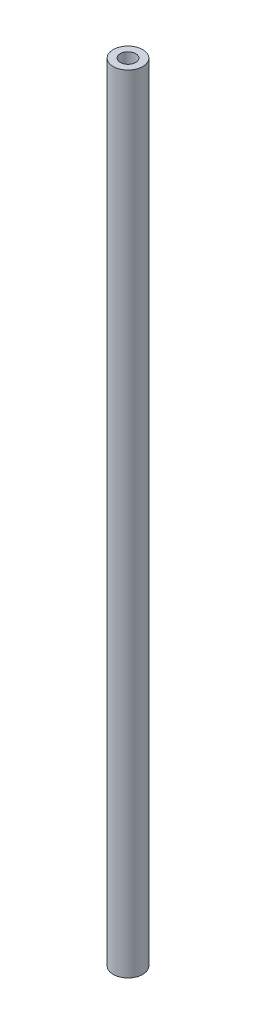
ISO-10303-21;
HEADER;
FILE_DESCRIPTION(('STEP AP214'),'2;1');
FILE_NAME('part.step','',(''),(''),'','','');
FILE_SCHEMA(('AUTOMOTIVE_DESIGN { 1 0 10303 214 1 1 1 1 }'));
ENDSEC;
DATA;
#1=APPLICATION_CONTEXT('core data for automotive mechanical design processes');
#2=APPLICATION_PROTOCOL_DEFINITION('international standard','automotive_design',2000,#1);
#3=PRODUCT_CONTEXT('',#1,'mechanical');
#4=PRODUCT('Part','Part','',(#3));
#5=PRODUCT_RELATED_PRODUCT_CATEGORY('part','',(#4));
#6=PRODUCT_DEFINITION_FORMATION('','',#4);
#7=PRODUCT_DEFINITION_CONTEXT('part definition',#1,'design');
#8=PRODUCT_DEFINITION('design','',#6,#7);
#9=PRODUCT_DEFINITION_SHAPE('','',#8);
#10=(LENGTH_UNIT() NAMED_UNIT(*) SI_UNIT(.MILLI.,.METRE.));
#11=(NAMED_UNIT(*) PLANE_ANGLE_UNIT() SI_UNIT($,.RADIAN.));
#12=(NAMED_UNIT(*) SI_UNIT($,.STERADIAN.) SOLID_ANGLE_UNIT());
#13=UNCERTAINTY_MEASURE_WITH_UNIT(LENGTH_MEASURE(1.E-05),#10,'distance_accuracy_value','');
#14=(GEOMETRIC_REPRESENTATION_CONTEXT(3) GLOBAL_UNCERTAINTY_ASSIGNED_CONTEXT((#13)) GLOBAL_UNIT_ASSIGNED_CONTEXT((#10,
#11,#12)) REPRESENTATION_CONTEXT('',''));
#15=CARTESIAN_POINT('',(0.,0.,0.));
#16=DIRECTION('',(0.,0.,1.));
#17=DIRECTION('',(1.,0.,0.));
#18=AXIS2_PLACEMENT_3D('',#15,#16,#17);
#19=CARTESIAN_POINT('',(0.,254.,0.));
#20=DIRECTION('',(0.,-1.,0.));
#21=DIRECTION('',(0.,0.,-1.));
#22=AXIS2_PLACEMENT_3D('',#19,#20,#21);
#23=CYLINDRICAL_SURFACE('',#22,4.7625);
#24=CARTESIAN_POINT('',(0.,254.,0.));
#25=DIRECTION('',(0.,1.,0.));
#26=DIRECTION('',(0.,0.,1.));
#27=AXIS2_PLACEMENT_3D('',#24,#25,#26);
#28=CIRCLE('',#27,4.7625);
#29=CARTESIAN_POINT('',(0.,254.,4.7625));
#30=VERTEX_POINT('',#29);
#31=EDGE_CURVE('E10',#30,#30,#28,.T.);
#32=ORIENTED_EDGE('',*,*,#31,.F.);
#33=EDGE_LOOP('',(#32));
#34=FACE_BOUND('',#33,.T.);
#35=CARTESIAN_POINT('',(0.,0.,0.));
#36=DIRECTION('',(0.,1.,0.));
#37=DIRECTION('',(0.,0.,1.));
#38=AXIS2_PLACEMENT_3D('',#35,#36,#37);
#39=CIRCLE('',#38,4.7625);
#40=CARTESIAN_POINT('',(0.,0.,4.7625));
#41=VERTEX_POINT('',#40);
#42=EDGE_CURVE('E38',#41,#41,#39,.T.);
#43=ORIENTED_EDGE('',*,*,#42,.T.);
#44=EDGE_LOOP('',(#43));
#45=FACE_BOUND('',#44,.T.);
#46=ADVANCED_FACE('F31',(#34,#45),#23,.T.);
#47=CARTESIAN_POINT('',(0.,254.,0.));
#48=DIRECTION('',(0.,1.,0.));
#49=DIRECTION('',(0.,0.,1.));
#50=AXIS2_PLACEMENT_3D('',#47,#48,#49);
#51=PLANE('',#50);
#52=CARTESIAN_POINT('',(0.,254.,0.));
#53=DIRECTION('',(0.,1.,0.));
#54=DIRECTION('',(0.,0.,1.));
#55=AXIS2_PLACEMENT_3D('',#52,#53,#54);
#56=CIRCLE('',#55,2.48919999999999);
#57=CARTESIAN_POINT('',(0.,254.,2.48919999999999));
#58=VERTEX_POINT('',#57);
#59=EDGE_CURVE('E44',#58,#58,#56,.T.);
#60=ORIENTED_EDGE('',*,*,#59,.F.);
#61=EDGE_LOOP('',(#60));
#62=FACE_BOUND('',#61,.T.);
#63=ORIENTED_EDGE('',*,*,#31,.T.);
#64=EDGE_LOOP('',(#63));
#65=FACE_BOUND('',#64,.T.);
#66=ADVANCED_FACE('F60',(#62,#65),#51,.T.);
#67=CARTESIAN_POINT('',(0.,0.,0.));
#68=DIRECTION('',(0.,1.,0.));
#69=DIRECTION('',(0.,0.,1.));
#70=AXIS2_PLACEMENT_3D('',#67,#68,#69);
#71=PLANE('',#70);
#72=CARTESIAN_POINT('',(0.,0.,0.));
#73=DIRECTION('',(0.,1.,0.));
#74=DIRECTION('',(0.,0.,1.));
#75=AXIS2_PLACEMENT_3D('',#72,#73,#74);
#76=CIRCLE('',#75,2.48919999999987);
#77=CARTESIAN_POINT('',(0.,0.,2.48919999999987));
#78=VERTEX_POINT('',#77);
#79=EDGE_CURVE('E34',#78,#78,#76,.T.);
#80=ORIENTED_EDGE('',*,*,#79,.T.);
#81=EDGE_LOOP('',(#80));
#82=FACE_BOUND('',#81,.T.);
#83=ORIENTED_EDGE('',*,*,#42,.F.);
#84=EDGE_LOOP('',(#83));
#85=FACE_BOUND('',#84,.T.);
#86=ADVANCED_FACE('F51',(#82,#85),#71,.F.);
#87=CARTESIAN_POINT('',(0.,254.,0.));
#88=DIRECTION('',(0.,1.,0.));
#89=DIRECTION('',(0.,0.,1.));
#90=AXIS2_PLACEMENT_3D('',#87,#88,#89);
#91=CYLINDRICAL_SURFACE('',#90,2.48919999999987);
#92=ORIENTED_EDGE('',*,*,#59,.T.);
#93=EDGE_LOOP('',(#92));
#94=FACE_BOUND('',#93,.T.);
#95=ORIENTED_EDGE('',*,*,#79,.F.);
#96=EDGE_LOOP('',(#95));
#97=FACE_BOUND('',#96,.T.);
#98=ADVANCED_FACE('F54',(#94,#97),#91,.F.);
#99=CLOSED_SHELL('',(#46,#66,#86,#98));
#100=MANIFOLD_SOLID_BREP('B2',#99);
#101=ADVANCED_BREP_SHAPE_REPRESENTATION('',(#18,#100),#14);
#102=SHAPE_DEFINITION_REPRESENTATION(#9,#101);
ENDSEC;
END-ISO-10303-21;
